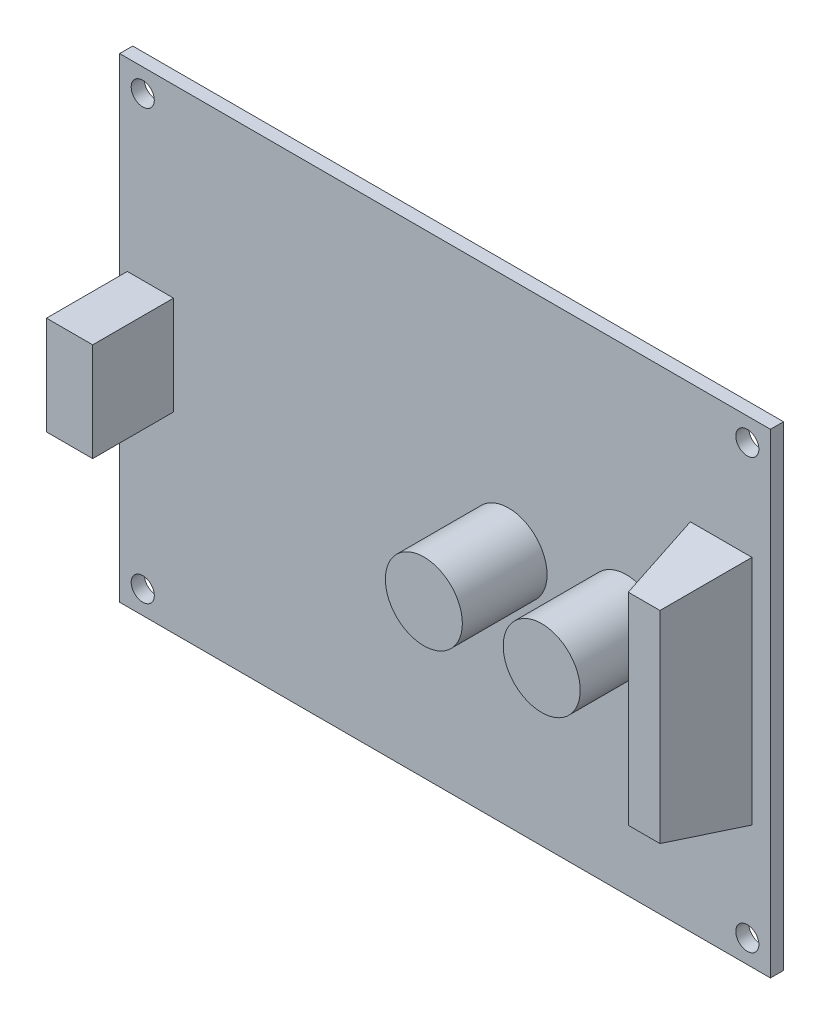
ISO-10303-21;
HEADER;
FILE_DESCRIPTION(('STEP AP214'),'2;1');
FILE_NAME('part.step','',(''),(''),'','','');
FILE_SCHEMA(('AUTOMOTIVE_DESIGN { 1 0 10303 214 1 1 1 1 }'));
ENDSEC;
DATA;
#1=APPLICATION_CONTEXT('core data for automotive mechanical design processes');
#2=APPLICATION_PROTOCOL_DEFINITION('international standard','automotive_design',2000,#1);
#3=PRODUCT_CONTEXT('',#1,'mechanical');
#4=PRODUCT('Part','Part','',(#3));
#5=PRODUCT_RELATED_PRODUCT_CATEGORY('part','',(#4));
#6=PRODUCT_DEFINITION_FORMATION('','',#4);
#7=PRODUCT_DEFINITION_CONTEXT('part definition',#1,'design');
#8=PRODUCT_DEFINITION('design','',#6,#7);
#9=PRODUCT_DEFINITION_SHAPE('','',#8);
#10=(LENGTH_UNIT() NAMED_UNIT(*) SI_UNIT(.MILLI.,.METRE.));
#11=(NAMED_UNIT(*) PLANE_ANGLE_UNIT() SI_UNIT($,.RADIAN.));
#12=(NAMED_UNIT(*) SI_UNIT($,.STERADIAN.) SOLID_ANGLE_UNIT());
#13=UNCERTAINTY_MEASURE_WITH_UNIT(LENGTH_MEASURE(1.E-05),#10,'distance_accuracy_value','');
#14=(GEOMETRIC_REPRESENTATION_CONTEXT(3) GLOBAL_UNCERTAINTY_ASSIGNED_CONTEXT((#13)) GLOBAL_UNIT_ASSIGNED_CONTEXT((#10,
#11,#12)) REPRESENTATION_CONTEXT('',''));
#15=CARTESIAN_POINT('',(0.,0.,0.));
#16=DIRECTION('',(0.,0.,1.));
#17=DIRECTION('',(1.,0.,0.));
#18=AXIS2_PLACEMENT_3D('',#15,#16,#17);
#19=CARTESIAN_POINT('',(0.,0.,1.7));
#20=DIRECTION('',(0.,0.,1.));
#21=DIRECTION('',(1.,0.,0.));
#22=AXIS2_PLACEMENT_3D('',#19,#20,#21);
#23=PLANE('',#22);
#24=CARTESIAN_POINT('',(50.402950310559,39.7399844720497,1.7));
#25=DIRECTION('',(0.,0.,1.));
#26=DIRECTION('',(1.,0.,0.));
#27=AXIS2_PLACEMENT_3D('',#24,#25,#26);
#28=CIRCLE('',#27,1.5);
#29=CARTESIAN_POINT('',(51.902950310559,39.7399844720497,1.7));
#30=VERTEX_POINT('',#29);
#31=EDGE_CURVE('E238',#30,#30,#28,.T.);
#32=ORIENTED_EDGE('',*,*,#31,.F.);
#33=EDGE_LOOP('',(#32));
#34=FACE_BOUND('',#33,.T.);
#35=CARTESIAN_POINT('',(50.402950310559,-15.9600155279503,1.7));
#36=DIRECTION('',(0.,0.,1.));
#37=DIRECTION('',(1.,0.,0.));
#38=AXIS2_PLACEMENT_3D('',#35,#36,#37);
#39=CIRCLE('',#38,1.5);
#40=CARTESIAN_POINT('',(51.902950310559,-15.9600155279503,1.7));
#41=VERTEX_POINT('',#40);
#42=EDGE_CURVE('E228',#41,#41,#39,.T.);
#43=ORIENTED_EDGE('',*,*,#42,.F.);
#44=EDGE_LOOP('',(#43));
#45=FACE_BOUND('',#44,.T.);
#46=CARTESIAN_POINT('',(-28.097049689441,39.7399844720497,1.7));
#47=DIRECTION('',(0.,0.,1.));
#48=DIRECTION('',(1.,0.,0.));
#49=AXIS2_PLACEMENT_3D('',#46,#47,#48);
#50=CIRCLE('',#49,1.5);
#51=CARTESIAN_POINT('',(-26.597049689441,39.7399844720497,1.7));
#52=VERTEX_POINT('',#51);
#53=EDGE_CURVE('E225',#52,#52,#50,.T.);
#54=ORIENTED_EDGE('',*,*,#53,.F.);
#55=EDGE_LOOP('',(#54));
#56=FACE_BOUND('',#55,.T.);
#57=CARTESIAN_POINT('',(-28.097049689441,-15.9600155279503,1.7));
#58=DIRECTION('',(0.,0.,1.));
#59=DIRECTION('',(1.,0.,0.));
#60=AXIS2_PLACEMENT_3D('',#57,#58,#59);
#61=CIRCLE('',#60,1.5);
#62=CARTESIAN_POINT('',(-26.597049689441,-15.9600155279503,1.7));
#63=VERTEX_POINT('',#62);
#64=EDGE_CURVE('E222',#63,#63,#61,.T.);
#65=ORIENTED_EDGE('',*,*,#64,.F.);
#66=EDGE_LOOP('',(#65));
#67=FACE_BOUND('',#66,.T.);
#68=CARTESIAN_POINT('',(34.702950310559,12.0399844720497,1.7));
#69=DIRECTION('',(0.,0.,1.));
#70=DIRECTION('',(1.,0.,0.));
#71=AXIS2_PLACEMENT_3D('',#68,#69,#70);
#72=CIRCLE('',#71,5.);
#73=CARTESIAN_POINT('',(39.702950310559,12.0399844720497,1.7));
#74=VERTEX_POINT('',#73);
#75=EDGE_CURVE('E150',#74,#74,#72,.T.);
#76=ORIENTED_EDGE('',*,*,#75,.F.);
#77=EDGE_LOOP('',(#76));
#78=FACE_BOUND('',#77,.T.);
#79=CARTESIAN_POINT('',(19.402950310559,11.8899844720497,1.7));
#80=DIRECTION('',(0.,0.,1.));
#81=DIRECTION('',(1.,0.,0.));
#82=AXIS2_PLACEMENT_3D('',#79,#80,#81);
#83=CIRCLE('',#82,5.);
#84=CARTESIAN_POINT('',(24.402950310559,11.8899844720497,1.7));
#85=VERTEX_POINT('',#84);
#86=EDGE_CURVE('E159',#85,#85,#83,.T.);
#87=ORIENTED_EDGE('',*,*,#86,.F.);
#88=EDGE_LOOP('',(#87));
#89=FACE_BOUND('',#88,.T.);
#90=DIRECTION('',(0.,-1.,0.));
#91=VECTOR('',#90,1.);
#92=CARTESIAN_POINT('',(-31.097049689441,42.7399844720497,1.7));
#93=LINE('',#92,#91);
#94=CARTESIAN_POINT('',(-31.097049689441,42.7399844720497,1.7));
#95=VERTEX_POINT('',#94);
#96=CARTESIAN_POINT('',(-31.097049689441,-18.9600155279503,1.7));
#97=VERTEX_POINT('',#96);
#98=EDGE_CURVE('E194',#95,#97,#93,.T.);
#99=ORIENTED_EDGE('',*,*,#98,.T.);
#100=DIRECTION('',(1.,0.,0.));
#101=VECTOR('',#100,1.);
#102=CARTESIAN_POINT('',(-31.097049689441,-18.9600155279503,1.7));
#103=LINE('',#102,#101);
#104=CARTESIAN_POINT('',(53.402950310559,-18.9600155279503,1.7));
#105=VERTEX_POINT('',#104);
#106=EDGE_CURVE('E197',#97,#105,#103,.T.);
#107=ORIENTED_EDGE('',*,*,#106,.T.);
#108=DIRECTION('',(0.,1.,0.));
#109=VECTOR('',#108,1.);
#110=CARTESIAN_POINT('',(53.402950310559,42.7399844720497,1.7));
#111=LINE('',#110,#109);
#112=CARTESIAN_POINT('',(53.402950310559,42.7399844720497,1.7));
#113=VERTEX_POINT('',#112);
#114=EDGE_CURVE('E200',#105,#113,#111,.T.);
#115=ORIENTED_EDGE('',*,*,#114,.T.);
#116=DIRECTION('',(-1.,0.,0.));
#117=VECTOR('',#116,1.);
#118=CARTESIAN_POINT('',(-31.097049689441,42.7399844720497,1.7));
#119=LINE('',#118,#117);
#120=EDGE_CURVE('E202',#113,#95,#119,.T.);
#121=ORIENTED_EDGE('',*,*,#120,.T.);
#122=EDGE_LOOP('',(#99,#107,#115,#121));
#123=FACE_BOUND('',#122,.T.);
#124=DIRECTION('',(1.,0.,0.));
#125=VECTOR('',#124,1.);
#126=CARTESIAN_POINT('',(43.002950310559,-2.9600155279503,1.7));
#127=LINE('',#126,#125);
#128=CARTESIAN_POINT('',(43.002950310559,-2.9600155279503,1.7));
#129=VERTEX_POINT('',#128);
#130=CARTESIAN_POINT('',(51.002950310559,-2.9600155279503,1.7));
#131=VERTEX_POINT('',#130);
#132=EDGE_CURVE('E169',#129,#131,#127,.T.);
#133=ORIENTED_EDGE('',*,*,#132,.F.);
#134=DIRECTION('',(0.,-1.,0.));
#135=VECTOR('',#134,1.);
#136=CARTESIAN_POINT('',(43.002950310559,27.1399844720497,1.7));
#137=LINE('',#136,#135);
#138=CARTESIAN_POINT('',(43.002950310559,27.1399844720497,1.7));
#139=VERTEX_POINT('',#138);
#140=EDGE_CURVE('E164',#139,#129,#137,.T.);
#141=ORIENTED_EDGE('',*,*,#140,.F.);
#142=DIRECTION('',(-1.,0.,0.));
#143=VECTOR('',#142,1.);
#144=CARTESIAN_POINT('',(43.002950310559,27.1399844720497,1.7));
#145=LINE('',#144,#143);
#146=CARTESIAN_POINT('',(51.002950310559,27.1399844720497,1.7));
#147=VERTEX_POINT('',#146);
#148=EDGE_CURVE('E173',#147,#139,#145,.T.);
#149=ORIENTED_EDGE('',*,*,#148,.F.);
#150=DIRECTION('',(0.,1.,0.));
#151=VECTOR('',#150,1.);
#152=CARTESIAN_POINT('',(51.002950310559,27.1399844720497,1.7));
#153=LINE('',#152,#151);
#154=EDGE_CURVE('E171',#131,#147,#153,.T.);
#155=ORIENTED_EDGE('',*,*,#154,.F.);
#156=EDGE_LOOP('',(#133,#141,#149,#155));
#157=FACE_BOUND('',#156,.T.);
#158=DIRECTION('',(1.,0.,0.));
#159=VECTOR('',#158,1.);
#160=CARTESIAN_POINT('',(-30.097049689441,5.9399844720497,1.7));
#161=LINE('',#160,#159);
#162=CARTESIAN_POINT('',(-30.097049689441,5.9399844720497,1.7));
#163=VERTEX_POINT('',#162);
#164=CARTESIAN_POINT('',(-24.097049689441,5.9399844720497,1.7));
#165=VERTEX_POINT('',#164);
#166=EDGE_CURVE('E247',#163,#165,#161,.T.);
#167=ORIENTED_EDGE('',*,*,#166,.F.);
#168=DIRECTION('',(0.,-1.,0.));
#169=VECTOR('',#168,1.);
#170=CARTESIAN_POINT('',(-30.097049689441,18.7399844720497,1.7));
#171=LINE('',#170,#169);
#172=CARTESIAN_POINT('',(-30.097049689441,18.7399844720497,1.7));
#173=VERTEX_POINT('',#172);
#174=EDGE_CURVE('E148',#173,#163,#171,.T.);
#175=ORIENTED_EDGE('',*,*,#174,.F.);
#176=DIRECTION('',(-1.,0.,0.));
#177=VECTOR('',#176,1.);
#178=CARTESIAN_POINT('',(-30.097049689441,18.7399844720497,1.7));
#179=LINE('',#178,#177);
#180=CARTESIAN_POINT('',(-24.097049689441,18.7399844720497,1.7));
#181=VERTEX_POINT('',#180);
#182=EDGE_CURVE('E144',#181,#173,#179,.T.);
#183=ORIENTED_EDGE('',*,*,#182,.F.);
#184=DIRECTION('',(0.,1.,0.));
#185=VECTOR('',#184,1.);
#186=CARTESIAN_POINT('',(-24.097049689441,18.7399844720497,1.7));
#187=LINE('',#186,#185);
#188=EDGE_CURVE('E249',#165,#181,#187,.T.);
#189=ORIENTED_EDGE('',*,*,#188,.F.);
#190=EDGE_LOOP('',(#167,#175,#183,#189));
#191=FACE_BOUND('',#190,.T.);
#192=ADVANCED_FACE('F33',(#34,#45,#56,#67,#78,#89,#123,#157,#191),#23,.T.);
#193=CARTESIAN_POINT('',(-31.097049689441,42.7399844720497,1.7));
#194=DIRECTION('',(1.,0.,0.));
#195=DIRECTION('',(0.,1.,0.));
#196=AXIS2_PLACEMENT_3D('',#193,#194,#195);
#197=PLANE('',#196);
#198=DIRECTION('',(0.,-1.,0.));
#199=VECTOR('',#198,1.);
#200=CARTESIAN_POINT('',(-31.097049689441,42.7399844720497,0.));
#201=LINE('',#200,#199);
#202=CARTESIAN_POINT('',(-31.097049689441,42.7399844720497,0.));
#203=VERTEX_POINT('',#202);
#204=CARTESIAN_POINT('',(-31.097049689441,-18.9600155279503,0.));
#205=VERTEX_POINT('',#204);
#206=EDGE_CURVE('E178',#203,#205,#201,.T.);
#207=ORIENTED_EDGE('',*,*,#206,.T.);
#208=DIRECTION('',(0.,0.,-1.));
#209=VECTOR('',#208,1.);
#210=CARTESIAN_POINT('',(-31.097049689441,-18.9600155279503,1.7));
#211=LINE('',#210,#209);
#212=EDGE_CURVE('E11',#97,#205,#211,.T.);
#213=ORIENTED_EDGE('',*,*,#212,.F.);
#214=ORIENTED_EDGE('',*,*,#98,.F.);
#215=DIRECTION('',(0.,0.,-1.));
#216=VECTOR('',#215,1.);
#217=CARTESIAN_POINT('',(-31.097049689441,42.7399844720497,1.7));
#218=LINE('',#217,#216);
#219=EDGE_CURVE('E204',#95,#203,#218,.T.);
#220=ORIENTED_EDGE('',*,*,#219,.T.);
#221=EDGE_LOOP('',(#207,#213,#214,#220));
#222=FACE_BOUND('',#221,.T.);
#223=ADVANCED_FACE('F35',(#222),#197,.F.);
#224=CARTESIAN_POINT('',(-31.097049689441,-18.9600155279503,1.7));
#225=DIRECTION('',(0.,1.,0.));
#226=DIRECTION('',(0.,0.,1.));
#227=AXIS2_PLACEMENT_3D('',#224,#225,#226);
#228=PLANE('',#227);
#229=DIRECTION('',(1.,0.,0.));
#230=VECTOR('',#229,1.);
#231=CARTESIAN_POINT('',(-31.097049689441,-18.9600155279503,0.));
#232=LINE('',#231,#230);
#233=CARTESIAN_POINT('',(53.402950310559,-18.9600155279503,0.));
#234=VERTEX_POINT('',#233);
#235=EDGE_CURVE('E207',#205,#234,#232,.T.);
#236=ORIENTED_EDGE('',*,*,#235,.T.);
#237=DIRECTION('',(0.,0.,-1.));
#238=VECTOR('',#237,1.);
#239=CARTESIAN_POINT('',(53.402950310559,-18.9600155279503,1.7));
#240=LINE('',#239,#238);
#241=EDGE_CURVE('E42',#105,#234,#240,.T.);
#242=ORIENTED_EDGE('',*,*,#241,.F.);
#243=ORIENTED_EDGE('',*,*,#106,.F.);
#244=ORIENTED_EDGE('',*,*,#212,.T.);
#245=EDGE_LOOP('',(#236,#242,#243,#244));
#246=FACE_BOUND('',#245,.T.);
#247=ADVANCED_FACE('F275',(#246),#228,.F.);
#248=CARTESIAN_POINT('',(53.402950310559,42.7399844720497,1.7));
#249=DIRECTION('',(-1.,0.,0.));
#250=DIRECTION('',(0.,-1.,0.));
#251=AXIS2_PLACEMENT_3D('',#248,#249,#250);
#252=PLANE('',#251);
#253=DIRECTION('',(0.,1.,0.));
#254=VECTOR('',#253,1.);
#255=CARTESIAN_POINT('',(53.402950310559,42.7399844720497,0.));
#256=LINE('',#255,#254);
#257=CARTESIAN_POINT('',(53.402950310559,42.7399844720497,0.));
#258=VERTEX_POINT('',#257);
#259=EDGE_CURVE('E209',#234,#258,#256,.T.);
#260=ORIENTED_EDGE('',*,*,#259,.T.);
#261=DIRECTION('',(0.,0.,-1.));
#262=VECTOR('',#261,1.);
#263=CARTESIAN_POINT('',(53.402950310559,42.7399844720497,1.7));
#264=LINE('',#263,#262);
#265=EDGE_CURVE('E214',#113,#258,#264,.T.);
#266=ORIENTED_EDGE('',*,*,#265,.F.);
#267=ORIENTED_EDGE('',*,*,#114,.F.);
#268=ORIENTED_EDGE('',*,*,#241,.T.);
#269=EDGE_LOOP('',(#260,#266,#267,#268));
#270=FACE_BOUND('',#269,.T.);
#271=ADVANCED_FACE('F290',(#270),#252,.F.);
#272=CARTESIAN_POINT('',(-31.097049689441,42.7399844720497,1.7));
#273=DIRECTION('',(0.,-1.,0.));
#274=DIRECTION('',(0.,0.,-1.));
#275=AXIS2_PLACEMENT_3D('',#272,#273,#274);
#276=PLANE('',#275);
#277=DIRECTION('',(-1.,0.,0.));
#278=VECTOR('',#277,1.);
#279=CARTESIAN_POINT('',(-31.097049689441,42.7399844720497,0.));
#280=LINE('',#279,#278);
#281=EDGE_CURVE('E198',#258,#203,#280,.T.);
#282=ORIENTED_EDGE('',*,*,#281,.T.);
#283=ORIENTED_EDGE('',*,*,#219,.F.);
#284=ORIENTED_EDGE('',*,*,#120,.F.);
#285=ORIENTED_EDGE('',*,*,#265,.T.);
#286=EDGE_LOOP('',(#282,#283,#284,#285));
#287=FACE_BOUND('',#286,.T.);
#288=ADVANCED_FACE('F286',(#287),#276,.F.);
#289=CARTESIAN_POINT('',(0.,0.,0.));
#290=DIRECTION('',(0.,0.,1.));
#291=DIRECTION('',(1.,0.,0.));
#292=AXIS2_PLACEMENT_3D('',#289,#290,#291);
#293=PLANE('',#292);
#294=CARTESIAN_POINT('',(50.402950310559,39.7399844720497,0.));
#295=DIRECTION('',(0.,0.,1.));
#296=DIRECTION('',(1.,0.,0.));
#297=AXIS2_PLACEMENT_3D('',#294,#295,#296);
#298=CIRCLE('',#297,1.5);
#299=CARTESIAN_POINT('',(51.902950310559,39.7399844720497,0.));
#300=VERTEX_POINT('',#299);
#301=EDGE_CURVE('E37',#300,#300,#298,.T.);
#302=ORIENTED_EDGE('',*,*,#301,.T.);
#303=EDGE_LOOP('',(#302));
#304=FACE_BOUND('',#303,.T.);
#305=CARTESIAN_POINT('',(50.402950310559,-15.9600155279503,0.));
#306=DIRECTION('',(0.,0.,1.));
#307=DIRECTION('',(1.,0.,0.));
#308=AXIS2_PLACEMENT_3D('',#305,#306,#307);
#309=CIRCLE('',#308,1.5);
#310=CARTESIAN_POINT('',(51.902950310559,-15.9600155279503,0.));
#311=VERTEX_POINT('',#310);
#312=EDGE_CURVE('E226',#311,#311,#309,.T.);
#313=ORIENTED_EDGE('',*,*,#312,.T.);
#314=EDGE_LOOP('',(#313));
#315=FACE_BOUND('',#314,.T.);
#316=CARTESIAN_POINT('',(-28.097049689441,39.7399844720497,0.));
#317=DIRECTION('',(0.,0.,1.));
#318=DIRECTION('',(1.,0.,0.));
#319=AXIS2_PLACEMENT_3D('',#316,#317,#318);
#320=CIRCLE('',#319,1.5);
#321=CARTESIAN_POINT('',(-26.597049689441,39.7399844720497,0.));
#322=VERTEX_POINT('',#321);
#323=EDGE_CURVE('E223',#322,#322,#320,.T.);
#324=ORIENTED_EDGE('',*,*,#323,.T.);
#325=EDGE_LOOP('',(#324));
#326=FACE_BOUND('',#325,.T.);
#327=CARTESIAN_POINT('',(-28.097049689441,-15.9600155279503,0.));
#328=DIRECTION('',(0.,0.,1.));
#329=DIRECTION('',(1.,0.,0.));
#330=AXIS2_PLACEMENT_3D('',#327,#328,#329);
#331=CIRCLE('',#330,1.5);
#332=CARTESIAN_POINT('',(-26.597049689441,-15.9600155279503,0.));
#333=VERTEX_POINT('',#332);
#334=EDGE_CURVE('E219',#333,#333,#331,.T.);
#335=ORIENTED_EDGE('',*,*,#334,.T.);
#336=EDGE_LOOP('',(#335));
#337=FACE_BOUND('',#336,.T.);
#338=ORIENTED_EDGE('',*,*,#206,.F.);
#339=ORIENTED_EDGE('',*,*,#281,.F.);
#340=ORIENTED_EDGE('',*,*,#259,.F.);
#341=ORIENTED_EDGE('',*,*,#235,.F.);
#342=EDGE_LOOP('',(#338,#339,#340,#341));
#343=FACE_BOUND('',#342,.T.);
#344=ADVANCED_FACE('F283',(#304,#315,#326,#337,#343),#293,.F.);
#345=CARTESIAN_POINT('',(43.002950310559,27.1399844720497,1.7));
#346=DIRECTION('',(-0.981627183447664,0.,0.190808995376545));
#347=DIRECTION('',(0.190808995376545,0.,0.981627183447664));
#348=AXIS2_PLACEMENT_3D('',#345,#346,#347);
#349=PLANE('',#348);
#350=ORIENTED_EDGE('',*,*,#140,.T.);
#351=DIRECTION('',(-0.187427559991896,-0.187427559991896,-0.964231206459824));
#352=VECTOR('',#351,1.);
#353=CARTESIAN_POINT('',(43.002950310559,-2.9600155279503,1.7));
#354=LINE('',#353,#352);
#355=CARTESIAN_POINT('',(44.9467534019362,-1.01621243657312,11.7));
#356=VERTEX_POINT('',#355);
#357=EDGE_CURVE('E176',#356,#129,#354,.T.);
#358=ORIENTED_EDGE('',*,*,#357,.F.);
#359=DIRECTION('',(0.,1.,0.));
#360=VECTOR('',#359,1.);
#361=CARTESIAN_POINT('',(44.9467534019362,27.1399844720497,11.7));
#362=LINE('',#361,#360);
#363=CARTESIAN_POINT('',(44.9467534019362,25.1961813806725,11.7));
#364=VERTEX_POINT('',#363);
#365=EDGE_CURVE('E175',#364,#356,#362,.F.);
#366=ORIENTED_EDGE('',*,*,#365,.F.);
#367=DIRECTION('',(-0.187427559991896,0.187427559991896,-0.964231206459824));
#368=VECTOR('',#367,1.);
#369=CARTESIAN_POINT('',(43.002950310559,27.1399844720497,1.7));
#370=LINE('',#369,#368);
#371=EDGE_CURVE('E180',#364,#139,#370,.T.);
#372=ORIENTED_EDGE('',*,*,#371,.T.);
#373=EDGE_LOOP('',(#350,#358,#366,#372));
#374=FACE_BOUND('',#373,.T.);
#375=ADVANCED_FACE('F285',(#374),#349,.T.);
#376=CARTESIAN_POINT('',(43.002950310559,-2.9600155279503,1.7));
#377=DIRECTION('',(0.,-0.981627183447664,0.190808995376545));
#378=DIRECTION('',(0.,-0.190808995376545,-0.981627183447664));
#379=AXIS2_PLACEMENT_3D('',#376,#377,#378);
#380=PLANE('',#379);
#381=ORIENTED_EDGE('',*,*,#132,.T.);
#382=DIRECTION('',(0.187427559991896,-0.187427559991896,-0.964231206459825));
#383=VECTOR('',#382,1.);
#384=CARTESIAN_POINT('',(49.9455646941991,-1.90262991159038,7.13977741907369));
#385=LINE('',#384,#383);
#386=CARTESIAN_POINT('',(49.0591472191818,-1.01621243657312,11.7));
#387=VERTEX_POINT('',#386);
#388=EDGE_CURVE('E179',#387,#131,#385,.T.);
#389=ORIENTED_EDGE('',*,*,#388,.F.);
#390=DIRECTION('',(-1.,0.,0.));
#391=VECTOR('',#390,1.);
#392=CARTESIAN_POINT('',(43.002950310559,-1.01621243657312,11.7));
#393=LINE('',#392,#391);
#394=EDGE_CURVE('E189',#356,#387,#393,.F.);
#395=ORIENTED_EDGE('',*,*,#394,.F.);
#396=ORIENTED_EDGE('',*,*,#357,.T.);
#397=EDGE_LOOP('',(#381,#389,#395,#396));
#398=FACE_BOUND('',#397,.T.);
#399=ADVANCED_FACE('F281',(#398),#380,.T.);
#400=CARTESIAN_POINT('',(51.002950310559,27.1399844720497,1.7));
#401=DIRECTION('',(0.981627183447664,0.,0.190808995376545));
#402=DIRECTION('',(0.190808995376545,0.,-0.981627183447664));
#403=AXIS2_PLACEMENT_3D('',#400,#401,#402);
#404=PLANE('',#403);
#405=ORIENTED_EDGE('',*,*,#154,.T.);
#406=DIRECTION('',(0.187427559991896,0.187427559991896,-0.964231206459825));
#407=VECTOR('',#406,1.);
#408=CARTESIAN_POINT('',(50.7219175886029,26.8589517500936,3.14578801835845));
#409=LINE('',#408,#407);
#410=CARTESIAN_POINT('',(49.0591472191818,25.1961813806725,11.7));
#411=VERTEX_POINT('',#410);
#412=EDGE_CURVE('E58',#411,#147,#409,.T.);
#413=ORIENTED_EDGE('',*,*,#412,.F.);
#414=DIRECTION('',(0.,-1.,0.));
#415=VECTOR('',#414,1.);
#416=CARTESIAN_POINT('',(49.0591472191818,27.1399844720497,11.7));
#417=LINE('',#416,#415);
#418=EDGE_CURVE('E191',#387,#411,#417,.F.);
#419=ORIENTED_EDGE('',*,*,#418,.F.);
#420=ORIENTED_EDGE('',*,*,#388,.T.);
#421=EDGE_LOOP('',(#405,#413,#419,#420));
#422=FACE_BOUND('',#421,.T.);
#423=ADVANCED_FACE('F320',(#422),#404,.T.);
#424=CARTESIAN_POINT('',(43.002950310559,27.1399844720497,1.7));
#425=DIRECTION('',(0.,0.981627183447664,0.190808995376545));
#426=DIRECTION('',(0.,-0.190808995376545,0.981627183447664));
#427=AXIS2_PLACEMENT_3D('',#424,#425,#426);
#428=PLANE('',#427);
#429=ORIENTED_EDGE('',*,*,#148,.T.);
#430=ORIENTED_EDGE('',*,*,#371,.F.);
#431=DIRECTION('',(1.,0.,0.));
#432=VECTOR('',#431,1.);
#433=CARTESIAN_POINT('',(43.002950310559,25.1961813806725,11.7));
#434=LINE('',#433,#432);
#435=EDGE_CURVE('E183',#411,#364,#434,.F.);
#436=ORIENTED_EDGE('',*,*,#435,.F.);
#437=ORIENTED_EDGE('',*,*,#412,.T.);
#438=EDGE_LOOP('',(#429,#430,#436,#437));
#439=FACE_BOUND('',#438,.T.);
#440=ADVANCED_FACE('F326',(#439),#428,.T.);
#441=CARTESIAN_POINT('',(0.,0.,11.7));
#442=DIRECTION('',(0.,0.,1.));
#443=DIRECTION('',(1.,0.,0.));
#444=AXIS2_PLACEMENT_3D('',#441,#442,#443);
#445=PLANE('',#444);
#446=ORIENTED_EDGE('',*,*,#365,.T.);
#447=ORIENTED_EDGE('',*,*,#394,.T.);
#448=ORIENTED_EDGE('',*,*,#418,.T.);
#449=ORIENTED_EDGE('',*,*,#435,.T.);
#450=EDGE_LOOP('',(#446,#447,#448,#449));
#451=FACE_BOUND('',#450,.T.);
#452=ADVANCED_FACE('F322',(#451),#445,.T.);
#453=CARTESIAN_POINT('',(19.402950310559,11.8899844720497,12.7));
#454=DIRECTION('',(0.,0.,-1.));
#455=DIRECTION('',(-1.,0.,0.));
#456=AXIS2_PLACEMENT_3D('',#453,#454,#455);
#457=CYLINDRICAL_SURFACE('',#456,5.);
#458=CARTESIAN_POINT('',(19.402950310559,11.8899844720497,12.7));
#459=DIRECTION('',(0.,0.,1.));
#460=DIRECTION('',(1.,0.,0.));
#461=AXIS2_PLACEMENT_3D('',#458,#459,#460);
#462=CIRCLE('',#461,5.);
#463=CARTESIAN_POINT('',(24.402950310559,11.8899844720497,12.7));
#464=VERTEX_POINT('',#463);
#465=EDGE_CURVE('E161',#464,#464,#462,.T.);
#466=ORIENTED_EDGE('',*,*,#465,.F.);
#467=EDGE_LOOP('',(#466));
#468=FACE_BOUND('',#467,.T.);
#469=ORIENTED_EDGE('',*,*,#86,.T.);
#470=EDGE_LOOP('',(#469));
#471=FACE_BOUND('',#470,.T.);
#472=ADVANCED_FACE('F333',(#468,#471),#457,.T.);
#473=CARTESIAN_POINT('',(19.402950310559,11.8899844720497,12.7));
#474=DIRECTION('',(0.,0.,1.));
#475=DIRECTION('',(1.,0.,0.));
#476=AXIS2_PLACEMENT_3D('',#473,#474,#475);
#477=PLANE('',#476);
#478=ORIENTED_EDGE('',*,*,#465,.T.);
#479=EDGE_LOOP('',(#478));
#480=FACE_BOUND('',#479,.T.);
#481=ADVANCED_FACE('F340',(#480),#477,.T.);
#482=CARTESIAN_POINT('',(34.702950310559,12.0399844720497,12.7));
#483=DIRECTION('',(0.,0.,-1.));
#484=DIRECTION('',(-1.,0.,0.));
#485=AXIS2_PLACEMENT_3D('',#482,#483,#484);
#486=CYLINDRICAL_SURFACE('',#485,5.);
#487=CARTESIAN_POINT('',(34.702950310559,12.0399844720497,12.7));
#488=DIRECTION('',(0.,0.,1.));
#489=DIRECTION('',(1.,0.,0.));
#490=AXIS2_PLACEMENT_3D('',#487,#488,#489);
#491=CIRCLE('',#490,5.);
#492=CARTESIAN_POINT('',(39.702950310559,12.0399844720497,12.7));
#493=VERTEX_POINT('',#492);
#494=EDGE_CURVE('E153',#493,#493,#491,.T.);
#495=ORIENTED_EDGE('',*,*,#494,.F.);
#496=EDGE_LOOP('',(#495));
#497=FACE_BOUND('',#496,.T.);
#498=ORIENTED_EDGE('',*,*,#75,.T.);
#499=EDGE_LOOP('',(#498));
#500=FACE_BOUND('',#499,.T.);
#501=ADVANCED_FACE('F344',(#497,#500),#486,.T.);
#502=CARTESIAN_POINT('',(34.702950310559,12.0399844720497,12.7));
#503=DIRECTION('',(0.,0.,1.));
#504=DIRECTION('',(1.,0.,0.));
#505=AXIS2_PLACEMENT_3D('',#502,#503,#504);
#506=PLANE('',#505);
#507=ORIENTED_EDGE('',*,*,#494,.T.);
#508=EDGE_LOOP('',(#507));
#509=FACE_BOUND('',#508,.T.);
#510=ADVANCED_FACE('F348',(#509),#506,.T.);
#511=CARTESIAN_POINT('',(-30.097049689441,18.7399844720497,12.2));
#512=DIRECTION('',(1.,0.,0.));
#513=DIRECTION('',(0.,0.,-1.));
#514=AXIS2_PLACEMENT_3D('',#511,#512,#513);
#515=PLANE('',#514);
#516=ORIENTED_EDGE('',*,*,#174,.T.);
#517=DIRECTION('',(0.,0.,-1.));
#518=VECTOR('',#517,1.);
#519=CARTESIAN_POINT('',(-30.097049689441,5.9399844720497,12.2));
#520=LINE('',#519,#518);
#521=CARTESIAN_POINT('',(-30.097049689441,5.9399844720497,12.2));
#522=VERTEX_POINT('',#521);
#523=EDGE_CURVE('E129',#522,#163,#520,.T.);
#524=ORIENTED_EDGE('',*,*,#523,.F.);
#525=DIRECTION('',(0.,-1.,0.));
#526=VECTOR('',#525,1.);
#527=CARTESIAN_POINT('',(-30.097049689441,18.7399844720497,12.2));
#528=LINE('',#527,#526);
#529=CARTESIAN_POINT('',(-30.097049689441,18.7399844720497,12.2));
#530=VERTEX_POINT('',#529);
#531=EDGE_CURVE('E136',#530,#522,#528,.T.);
#532=ORIENTED_EDGE('',*,*,#531,.F.);
#533=DIRECTION('',(0.,0.,-1.));
#534=VECTOR('',#533,1.);
#535=CARTESIAN_POINT('',(-30.097049689441,18.7399844720497,12.2));
#536=LINE('',#535,#534);
#537=EDGE_CURVE('E245',#530,#173,#536,.T.);
#538=ORIENTED_EDGE('',*,*,#537,.T.);
#539=EDGE_LOOP('',(#516,#524,#532,#538));
#540=FACE_BOUND('',#539,.T.);
#541=ADVANCED_FACE('F146',(#540),#515,.F.);
#542=CARTESIAN_POINT('',(-30.097049689441,5.9399844720497,12.2));
#543=DIRECTION('',(0.,1.,0.));
#544=DIRECTION('',(0.,0.,1.));
#545=AXIS2_PLACEMENT_3D('',#542,#543,#544);
#546=PLANE('',#545);
#547=ORIENTED_EDGE('',*,*,#166,.T.);
#548=DIRECTION('',(0.,0.,-1.));
#549=VECTOR('',#548,1.);
#550=CARTESIAN_POINT('',(-24.097049689441,5.9399844720497,12.2));
#551=LINE('',#550,#549);
#552=CARTESIAN_POINT('',(-24.097049689441,5.9399844720497,12.2));
#553=VERTEX_POINT('',#552);
#554=EDGE_CURVE('E132',#553,#165,#551,.T.);
#555=ORIENTED_EDGE('',*,*,#554,.F.);
#556=DIRECTION('',(1.,0.,0.));
#557=VECTOR('',#556,1.);
#558=CARTESIAN_POINT('',(-30.097049689441,5.9399844720497,12.2));
#559=LINE('',#558,#557);
#560=EDGE_CURVE('E125',#522,#553,#559,.T.);
#561=ORIENTED_EDGE('',*,*,#560,.F.);
#562=ORIENTED_EDGE('',*,*,#523,.T.);
#563=EDGE_LOOP('',(#547,#555,#561,#562));
#564=FACE_BOUND('',#563,.T.);
#565=ADVANCED_FACE('F127',(#564),#546,.F.);
#566=CARTESIAN_POINT('',(-24.097049689441,18.7399844720497,12.2));
#567=DIRECTION('',(-1.,0.,0.));
#568=DIRECTION('',(0.,0.,1.));
#569=AXIS2_PLACEMENT_3D('',#566,#567,#568);
#570=PLANE('',#569);
#571=ORIENTED_EDGE('',*,*,#188,.T.);
#572=DIRECTION('',(0.,0.,-1.));
#573=VECTOR('',#572,1.);
#574=CARTESIAN_POINT('',(-24.097049689441,18.7399844720497,12.2));
#575=LINE('',#574,#573);
#576=CARTESIAN_POINT('',(-24.097049689441,18.7399844720497,12.2));
#577=VERTEX_POINT('',#576);
#578=EDGE_CURVE('E50',#577,#181,#575,.T.);
#579=ORIENTED_EDGE('',*,*,#578,.F.);
#580=DIRECTION('',(0.,1.,0.));
#581=VECTOR('',#580,1.);
#582=CARTESIAN_POINT('',(-24.097049689441,18.7399844720497,12.2));
#583=LINE('',#582,#581);
#584=EDGE_CURVE('E135',#553,#577,#583,.T.);
#585=ORIENTED_EDGE('',*,*,#584,.F.);
#586=ORIENTED_EDGE('',*,*,#554,.T.);
#587=EDGE_LOOP('',(#571,#579,#585,#586));
#588=FACE_BOUND('',#587,.T.);
#589=ADVANCED_FACE('F256',(#588),#570,.F.);
#590=CARTESIAN_POINT('',(-30.097049689441,18.7399844720497,12.2));
#591=DIRECTION('',(0.,-1.,0.));
#592=DIRECTION('',(0.,0.,-1.));
#593=AXIS2_PLACEMENT_3D('',#590,#591,#592);
#594=PLANE('',#593);
#595=ORIENTED_EDGE('',*,*,#182,.T.);
#596=ORIENTED_EDGE('',*,*,#537,.F.);
#597=DIRECTION('',(-1.,0.,0.));
#598=VECTOR('',#597,1.);
#599=CARTESIAN_POINT('',(-30.097049689441,18.7399844720497,12.2));
#600=LINE('',#599,#598);
#601=EDGE_CURVE('E140',#577,#530,#600,.T.);
#602=ORIENTED_EDGE('',*,*,#601,.F.);
#603=ORIENTED_EDGE('',*,*,#578,.T.);
#604=EDGE_LOOP('',(#595,#596,#602,#603));
#605=FACE_BOUND('',#604,.T.);
#606=ADVANCED_FACE('F257',(#605),#594,.F.);
#607=CARTESIAN_POINT('',(0.,0.,12.2));
#608=DIRECTION('',(0.,0.,1.));
#609=DIRECTION('',(1.,0.,0.));
#610=AXIS2_PLACEMENT_3D('',#607,#608,#609);
#611=PLANE('',#610);
#612=ORIENTED_EDGE('',*,*,#531,.T.);
#613=ORIENTED_EDGE('',*,*,#560,.T.);
#614=ORIENTED_EDGE('',*,*,#584,.T.);
#615=ORIENTED_EDGE('',*,*,#601,.T.);
#616=EDGE_LOOP('',(#612,#613,#614,#615));
#617=FACE_BOUND('',#616,.T.);
#618=ADVANCED_FACE('F139',(#617),#611,.T.);
#619=CARTESIAN_POINT('',(-28.097049689441,-15.9600155279503,-8.3));
#620=DIRECTION('',(0.,0.,1.));
#621=DIRECTION('',(1.,0.,0.));
#622=AXIS2_PLACEMENT_3D('',#619,#620,#621);
#623=CYLINDRICAL_SURFACE('',#622,1.5);
#624=ORIENTED_EDGE('',*,*,#64,.T.);
#625=EDGE_LOOP('',(#624));
#626=FACE_BOUND('',#625,.T.);
#627=ORIENTED_EDGE('',*,*,#334,.F.);
#628=EDGE_LOOP('',(#627));
#629=FACE_BOUND('',#628,.T.);
#630=ADVANCED_FACE('F264',(#626,#629),#623,.F.);
#631=CARTESIAN_POINT('',(-28.097049689441,39.7399844720497,-8.3));
#632=DIRECTION('',(0.,0.,1.));
#633=DIRECTION('',(1.,0.,0.));
#634=AXIS2_PLACEMENT_3D('',#631,#632,#633);
#635=CYLINDRICAL_SURFACE('',#634,1.5);
#636=ORIENTED_EDGE('',*,*,#53,.T.);
#637=EDGE_LOOP('',(#636));
#638=FACE_BOUND('',#637,.T.);
#639=ORIENTED_EDGE('',*,*,#323,.F.);
#640=EDGE_LOOP('',(#639));
#641=FACE_BOUND('',#640,.T.);
#642=ADVANCED_FACE('F383',(#638,#641),#635,.F.);
#643=CARTESIAN_POINT('',(50.402950310559,-15.9600155279503,-8.3));
#644=DIRECTION('',(0.,0.,1.));
#645=DIRECTION('',(1.,0.,0.));
#646=AXIS2_PLACEMENT_3D('',#643,#644,#645);
#647=CYLINDRICAL_SURFACE('',#646,1.5);
#648=ORIENTED_EDGE('',*,*,#42,.T.);
#649=EDGE_LOOP('',(#648));
#650=FACE_BOUND('',#649,.T.);
#651=ORIENTED_EDGE('',*,*,#312,.F.);
#652=EDGE_LOOP('',(#651));
#653=FACE_BOUND('',#652,.T.);
#654=ADVANCED_FACE('F392',(#650,#653),#647,.F.);
#655=CARTESIAN_POINT('',(50.402950310559,39.7399844720497,-8.3));
#656=DIRECTION('',(0.,0.,1.));
#657=DIRECTION('',(1.,0.,0.));
#658=AXIS2_PLACEMENT_3D('',#655,#656,#657);
#659=CYLINDRICAL_SURFACE('',#658,1.5);
#660=ORIENTED_EDGE('',*,*,#31,.T.);
#661=EDGE_LOOP('',(#660));
#662=FACE_BOUND('',#661,.T.);
#663=ORIENTED_EDGE('',*,*,#301,.F.);
#664=EDGE_LOOP('',(#663));
#665=FACE_BOUND('',#664,.T.);
#666=ADVANCED_FACE('F401',(#662,#665),#659,.F.);
#667=CLOSED_SHELL('',(#192,#223,#247,#271,#288,#344,#375,#399,#423,#440,#452,#472,#481,#501,
#510,#541,#565,#589,#606,#618,#630,#642,#654,#666));
#668=MANIFOLD_SOLID_BREP('B2',#667);
#669=ADVANCED_BREP_SHAPE_REPRESENTATION('',(#18,#668),#14);
#670=SHAPE_DEFINITION_REPRESENTATION(#9,#669);
ENDSEC;
END-ISO-10303-21;
